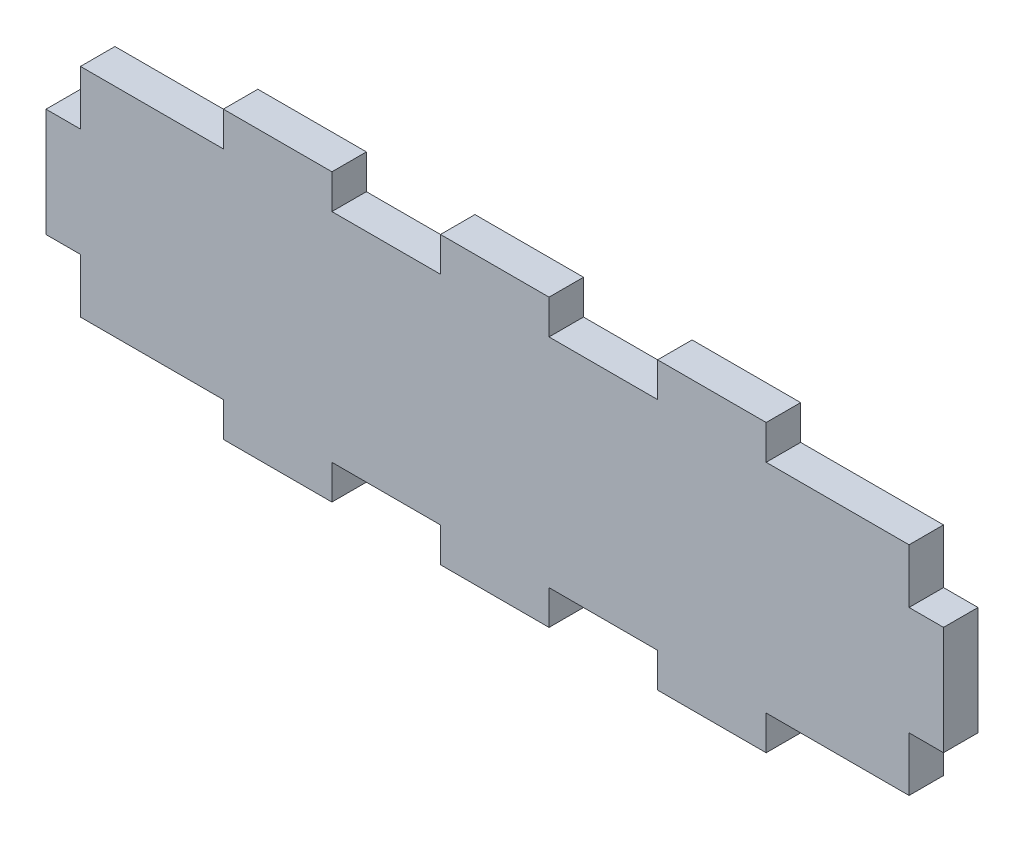
ISO-10303-21;
HEADER;
FILE_DESCRIPTION(('STEP AP214'),'2;1');
FILE_NAME('part.step','',(''),(''),'','','');
FILE_SCHEMA(('AUTOMOTIVE_DESIGN { 1 0 10303 214 1 1 1 1 }'));
ENDSEC;
DATA;
#1=APPLICATION_CONTEXT('core data for automotive mechanical design processes');
#2=APPLICATION_PROTOCOL_DEFINITION('international standard','automotive_design',2000,#1);
#3=PRODUCT_CONTEXT('',#1,'mechanical');
#4=PRODUCT('Part','Part','',(#3));
#5=PRODUCT_RELATED_PRODUCT_CATEGORY('part','',(#4));
#6=PRODUCT_DEFINITION_FORMATION('','',#4);
#7=PRODUCT_DEFINITION_CONTEXT('part definition',#1,'design');
#8=PRODUCT_DEFINITION('design','',#6,#7);
#9=PRODUCT_DEFINITION_SHAPE('','',#8);
#10=(LENGTH_UNIT() NAMED_UNIT(*) SI_UNIT(.MILLI.,.METRE.));
#11=(NAMED_UNIT(*) PLANE_ANGLE_UNIT() SI_UNIT($,.RADIAN.));
#12=(NAMED_UNIT(*) SI_UNIT($,.STERADIAN.) SOLID_ANGLE_UNIT());
#13=UNCERTAINTY_MEASURE_WITH_UNIT(LENGTH_MEASURE(1.E-05),#10,'distance_accuracy_value','');
#14=(GEOMETRIC_REPRESENTATION_CONTEXT(3) GLOBAL_UNCERTAINTY_ASSIGNED_CONTEXT((#13)) GLOBAL_UNIT_ASSIGNED_CONTEXT((#10,
#11,#12)) REPRESENTATION_CONTEXT('',''));
#15=CARTESIAN_POINT('',(0.,0.,0.));
#16=DIRECTION('',(0.,0.,1.));
#17=DIRECTION('',(1.,0.,0.));
#18=AXIS2_PLACEMENT_3D('',#15,#16,#17);
#19=CARTESIAN_POINT('',(-82.675,26.35,6.35));
#20=DIRECTION('',(0.,-1.,0.));
#21=DIRECTION('',(0.,0.,-1.));
#22=AXIS2_PLACEMENT_3D('',#19,#20,#21);
#23=PLANE('',#22);
#24=DIRECTION('',(0.,0.,1.));
#25=VECTOR('',#24,1.);
#26=CARTESIAN_POINT('',(-50.,26.35,0.));
#27=LINE('',#26,#25);
#28=CARTESIAN_POINT('',(-50.,26.35,0.));
#29=VERTEX_POINT('',#28);
#30=CARTESIAN_POINT('',(-50.,26.35,6.35));
#31=VERTEX_POINT('',#30);
#32=EDGE_CURVE('E356',#29,#31,#27,.T.);
#33=ORIENTED_EDGE('',*,*,#32,.T.);
#34=DIRECTION('',(-1.,0.,0.));
#35=VECTOR('',#34,1.);
#36=CARTESIAN_POINT('',(-82.675,26.35,6.35));
#37=LINE('',#36,#35);
#38=CARTESIAN_POINT('',(-30.,26.35,6.35));
#39=VERTEX_POINT('',#38);
#40=EDGE_CURVE('E51',#39,#31,#37,.T.);
#41=ORIENTED_EDGE('',*,*,#40,.F.);
#42=DIRECTION('',(0.,0.,1.));
#43=VECTOR('',#42,1.);
#44=CARTESIAN_POINT('',(-30.,26.35,0.));
#45=LINE('',#44,#43);
#46=CARTESIAN_POINT('',(-30.,26.35,0.));
#47=VERTEX_POINT('',#46);
#48=EDGE_CURVE('E394',#47,#39,#45,.T.);
#49=ORIENTED_EDGE('',*,*,#48,.F.);
#50=DIRECTION('',(-1.,0.,0.));
#51=VECTOR('',#50,1.);
#52=CARTESIAN_POINT('',(-82.675,26.35,0.));
#53=LINE('',#52,#51);
#54=EDGE_CURVE('E43',#47,#29,#53,.T.);
#55=ORIENTED_EDGE('',*,*,#54,.T.);
#56=EDGE_LOOP('',(#33,#41,#49,#55));
#57=FACE_BOUND('',#56,.T.);
#58=ADVANCED_FACE('F39',(#57),#23,.F.);
#59=DIRECTION('',(0.,0.,1.));
#60=VECTOR('',#59,1.);
#61=CARTESIAN_POINT('',(50.,26.35,0.));
#62=LINE('',#61,#60);
#63=CARTESIAN_POINT('',(50.,26.35,0.));
#64=VERTEX_POINT('',#63);
#65=CARTESIAN_POINT('',(50.,26.35,6.35));
#66=VERTEX_POINT('',#65);
#67=EDGE_CURVE('E312',#64,#66,#62,.T.);
#68=ORIENTED_EDGE('',*,*,#67,.F.);
#69=CARTESIAN_POINT('',(30.,26.35,0.));
#70=VERTEX_POINT('',#69);
#71=EDGE_CURVE('E619',#64,#70,#53,.T.);
#72=ORIENTED_EDGE('',*,*,#71,.T.);
#73=DIRECTION('',(0.,0.,1.));
#74=VECTOR('',#73,1.);
#75=CARTESIAN_POINT('',(30.,26.35,0.));
#76=LINE('',#75,#74);
#77=CARTESIAN_POINT('',(30.,26.35,6.35));
#78=VERTEX_POINT('',#77);
#79=EDGE_CURVE('E319',#70,#78,#76,.T.);
#80=ORIENTED_EDGE('',*,*,#79,.T.);
#81=EDGE_CURVE('E11',#66,#78,#37,.T.);
#82=ORIENTED_EDGE('',*,*,#81,.F.);
#83=EDGE_LOOP('',(#68,#72,#80,#82));
#84=FACE_BOUND('',#83,.T.);
#85=ADVANCED_FACE('F697',(#84),#23,.F.);
#86=DIRECTION('',(0.,0.,1.));
#87=VECTOR('',#86,1.);
#88=CARTESIAN_POINT('',(9.99999999999999,26.35,0.));
#89=LINE('',#88,#87);
#90=CARTESIAN_POINT('',(9.99999999999999,26.35,0.));
#91=VERTEX_POINT('',#90);
#92=CARTESIAN_POINT('',(9.99999999999999,26.35,6.35));
#93=VERTEX_POINT('',#92);
#94=EDGE_CURVE('E315',#91,#93,#89,.T.);
#95=ORIENTED_EDGE('',*,*,#94,.F.);
#96=CARTESIAN_POINT('',(-10.,26.35,0.));
#97=VERTEX_POINT('',#96);
#98=EDGE_CURVE('E299',#91,#97,#53,.T.);
#99=ORIENTED_EDGE('',*,*,#98,.T.);
#100=DIRECTION('',(0.,0.,1.));
#101=VECTOR('',#100,1.);
#102=CARTESIAN_POINT('',(-10.,26.35,0.));
#103=LINE('',#102,#101);
#104=CARTESIAN_POINT('',(-10.,26.35,6.35));
#105=VERTEX_POINT('',#104);
#106=EDGE_CURVE('E398',#97,#105,#103,.T.);
#107=ORIENTED_EDGE('',*,*,#106,.T.);
#108=EDGE_CURVE('E49',#93,#105,#37,.T.);
#109=ORIENTED_EDGE('',*,*,#108,.F.);
#110=EDGE_LOOP('',(#95,#99,#107,#109));
#111=FACE_BOUND('',#110,.T.);
#112=ADVANCED_FACE('F700',(#111),#23,.F.);
#113=CARTESIAN_POINT('',(0.,0.,6.35));
#114=DIRECTION('',(0.,0.,1.));
#115=DIRECTION('',(1.,0.,0.));
#116=AXIS2_PLACEMENT_3D('',#113,#114,#115);
#117=PLANE('',#116);
#118=ORIENTED_EDGE('',*,*,#40,.T.);
#119=DIRECTION('',(0.,-1.,0.));
#120=VECTOR('',#119,1.);
#121=CARTESIAN_POINT('',(-50.,26.35,6.35));
#122=LINE('',#121,#120);
#123=CARTESIAN_POINT('',(-50.,20.,6.35));
#124=VERTEX_POINT('',#123);
#125=EDGE_CURVE('E357',#31,#124,#122,.T.);
#126=ORIENTED_EDGE('',*,*,#125,.T.);
#127=DIRECTION('',(-1.,0.,0.));
#128=VECTOR('',#127,1.);
#129=CARTESIAN_POINT('',(-50.,20.,6.35));
#130=LINE('',#129,#128);
#131=CARTESIAN_POINT('',(-76.325,20.,6.35));
#132=VERTEX_POINT('',#131);
#133=EDGE_CURVE('E353',#124,#132,#130,.T.);
#134=ORIENTED_EDGE('',*,*,#133,.T.);
#135=DIRECTION('',(0.,1.,0.));
#136=VECTOR('',#135,1.);
#137=CARTESIAN_POINT('',(-76.325,26.35,6.35));
#138=LINE('',#137,#136);
#139=CARTESIAN_POINT('',(-76.325,10.,6.35));
#140=VERTEX_POINT('',#139);
#141=EDGE_CURVE('E599',#140,#132,#138,.T.);
#142=ORIENTED_EDGE('',*,*,#141,.F.);
#143=DIRECTION('',(1.,0.,0.));
#144=VECTOR('',#143,1.);
#145=CARTESIAN_POINT('',(-82.675,10.,6.35));
#146=LINE('',#145,#144);
#147=CARTESIAN_POINT('',(-82.675,10.,6.35));
#148=VERTEX_POINT('',#147);
#149=EDGE_CURVE('E547',#148,#140,#146,.T.);
#150=ORIENTED_EDGE('',*,*,#149,.F.);
#151=DIRECTION('',(0.,-1.,0.));
#152=VECTOR('',#151,1.);
#153=CARTESIAN_POINT('',(-82.675,26.35,6.35));
#154=LINE('',#153,#152);
#155=CARTESIAN_POINT('',(-82.675,-10.,6.35));
#156=VERTEX_POINT('',#155);
#157=EDGE_CURVE('E614',#148,#156,#154,.T.);
#158=ORIENTED_EDGE('',*,*,#157,.T.);
#159=DIRECTION('',(-1.,0.,0.));
#160=VECTOR('',#159,1.);
#161=CARTESIAN_POINT('',(-82.675,-10.,6.35));
#162=LINE('',#161,#160);
#163=CARTESIAN_POINT('',(-76.325,-10.,6.35));
#164=VERTEX_POINT('',#163);
#165=EDGE_CURVE('E575',#164,#156,#162,.T.);
#166=ORIENTED_EDGE('',*,*,#165,.F.);
#167=DIRECTION('',(0.,1.,0.));
#168=VECTOR('',#167,1.);
#169=CARTESIAN_POINT('',(-76.325,-10.,6.35));
#170=LINE('',#169,#168);
#171=CARTESIAN_POINT('',(-76.325,-20.,6.35));
#172=VERTEX_POINT('',#171);
#173=EDGE_CURVE('E580',#172,#164,#170,.T.);
#174=ORIENTED_EDGE('',*,*,#173,.F.);
#175=DIRECTION('',(-1.,0.,0.));
#176=VECTOR('',#175,1.);
#177=CARTESIAN_POINT('',(-50.,-20.,6.35));
#178=LINE('',#177,#176);
#179=CARTESIAN_POINT('',(-50.,-20.,6.35));
#180=VERTEX_POINT('',#179);
#181=EDGE_CURVE('E474',#180,#172,#178,.T.);
#182=ORIENTED_EDGE('',*,*,#181,.F.);
#183=DIRECTION('',(0.,1.,0.));
#184=VECTOR('',#183,1.);
#185=CARTESIAN_POINT('',(-50.,-26.35,6.35));
#186=LINE('',#185,#184);
#187=CARTESIAN_POINT('',(-50.,-26.35,6.35));
#188=VERTEX_POINT('',#187);
#189=EDGE_CURVE('E397',#188,#180,#186,.T.);
#190=ORIENTED_EDGE('',*,*,#189,.F.);
#191=DIRECTION('',(1.,0.,0.));
#192=VECTOR('',#191,1.);
#193=CARTESIAN_POINT('',(-82.675,-26.35,6.35));
#194=LINE('',#193,#192);
#195=CARTESIAN_POINT('',(-30.,-26.35,6.35));
#196=VERTEX_POINT('',#195);
#197=EDGE_CURVE('E624',#188,#196,#194,.T.);
#198=ORIENTED_EDGE('',*,*,#197,.T.);
#199=DIRECTION('',(0.,-1.,0.));
#200=VECTOR('',#199,1.);
#201=CARTESIAN_POINT('',(-30.,-26.35,6.35));
#202=LINE('',#201,#200);
#203=CARTESIAN_POINT('',(-30.,-20.,6.35));
#204=VERTEX_POINT('',#203);
#205=EDGE_CURVE('E434',#204,#196,#202,.T.);
#206=ORIENTED_EDGE('',*,*,#205,.F.);
#207=DIRECTION('',(-1.,0.,0.));
#208=VECTOR('',#207,1.);
#209=CARTESIAN_POINT('',(-30.,-20.,6.35));
#210=LINE('',#209,#208);
#211=CARTESIAN_POINT('',(-10.,-20.,6.35));
#212=VERTEX_POINT('',#211);
#213=EDGE_CURVE('E497',#212,#204,#210,.T.);
#214=ORIENTED_EDGE('',*,*,#213,.F.);
#215=DIRECTION('',(0.,1.,0.));
#216=VECTOR('',#215,1.);
#217=CARTESIAN_POINT('',(-10.,-26.35,6.35));
#218=LINE('',#217,#216);
#219=CARTESIAN_POINT('',(-10.,-26.35,6.35));
#220=VERTEX_POINT('',#219);
#221=EDGE_CURVE('E508',#220,#212,#218,.T.);
#222=ORIENTED_EDGE('',*,*,#221,.F.);
#223=CARTESIAN_POINT('',(9.99999999999999,-26.35,6.35));
#224=VERTEX_POINT('',#223);
#225=EDGE_CURVE('E623',#220,#224,#194,.T.);
#226=ORIENTED_EDGE('',*,*,#225,.T.);
#227=DIRECTION('',(0.,-1.,0.));
#228=VECTOR('',#227,1.);
#229=CARTESIAN_POINT('',(9.99999999999999,-26.35,6.35));
#230=LINE('',#229,#228);
#231=CARTESIAN_POINT('',(9.99999999999999,-20.,6.35));
#232=VERTEX_POINT('',#231);
#233=EDGE_CURVE('E420',#232,#224,#230,.T.);
#234=ORIENTED_EDGE('',*,*,#233,.F.);
#235=DIRECTION('',(-1.,0.,0.));
#236=VECTOR('',#235,1.);
#237=CARTESIAN_POINT('',(9.99999999999999,-20.,6.35));
#238=LINE('',#237,#236);
#239=CARTESIAN_POINT('',(30.,-20.,6.35));
#240=VERTEX_POINT('',#239);
#241=EDGE_CURVE('E411',#240,#232,#238,.T.);
#242=ORIENTED_EDGE('',*,*,#241,.F.);
#243=DIRECTION('',(0.,1.,0.));
#244=VECTOR('',#243,1.);
#245=CARTESIAN_POINT('',(30.,-26.35,6.35));
#246=LINE('',#245,#244);
#247=CARTESIAN_POINT('',(30.,-26.35,6.35));
#248=VERTEX_POINT('',#247);
#249=EDGE_CURVE('E423',#248,#240,#246,.T.);
#250=ORIENTED_EDGE('',*,*,#249,.F.);
#251=CARTESIAN_POINT('',(50.,-26.35,6.35));
#252=VERTEX_POINT('',#251);
#253=EDGE_CURVE('E618',#248,#252,#194,.T.);
#254=ORIENTED_EDGE('',*,*,#253,.T.);
#255=DIRECTION('',(0.,-1.,0.));
#256=VECTOR('',#255,1.);
#257=CARTESIAN_POINT('',(50.,-26.35,6.35));
#258=LINE('',#257,#256);
#259=CARTESIAN_POINT('',(50.,-20.,6.35));
#260=VERTEX_POINT('',#259);
#261=EDGE_CURVE('E454',#260,#252,#258,.T.);
#262=ORIENTED_EDGE('',*,*,#261,.F.);
#263=DIRECTION('',(-1.,0.,0.));
#264=VECTOR('',#263,1.);
#265=CARTESIAN_POINT('',(50.,-20.,6.35));
#266=LINE('',#265,#264);
#267=CARTESIAN_POINT('',(76.325,-20.,6.35));
#268=VERTEX_POINT('',#267);
#269=EDGE_CURVE('E449',#268,#260,#266,.T.);
#270=ORIENTED_EDGE('',*,*,#269,.F.);
#271=DIRECTION('',(0.,1.,0.));
#272=VECTOR('',#271,1.);
#273=CARTESIAN_POINT('',(76.325,-10.,6.35));
#274=LINE('',#273,#272);
#275=CARTESIAN_POINT('',(76.325,-10.,6.35));
#276=VERTEX_POINT('',#275);
#277=EDGE_CURVE('E532',#268,#276,#274,.T.);
#278=ORIENTED_EDGE('',*,*,#277,.T.);
#279=DIRECTION('',(1.,0.,0.));
#280=VECTOR('',#279,1.);
#281=CARTESIAN_POINT('',(82.675,-10.,6.35));
#282=LINE('',#281,#280);
#283=CARTESIAN_POINT('',(82.675,-10.,6.35));
#284=VERTEX_POINT('',#283);
#285=EDGE_CURVE('E536',#276,#284,#282,.T.);
#286=ORIENTED_EDGE('',*,*,#285,.T.);
#287=DIRECTION('',(0.,1.,0.));
#288=VECTOR('',#287,1.);
#289=CARTESIAN_POINT('',(82.675,26.35,6.35));
#290=LINE('',#289,#288);
#291=CARTESIAN_POINT('',(82.675,10.,6.35));
#292=VERTEX_POINT('',#291);
#293=EDGE_CURVE('E625',#284,#292,#290,.T.);
#294=ORIENTED_EDGE('',*,*,#293,.T.);
#295=DIRECTION('',(-1.,0.,0.));
#296=VECTOR('',#295,1.);
#297=CARTESIAN_POINT('',(82.675,10.,6.35));
#298=LINE('',#297,#296);
#299=CARTESIAN_POINT('',(76.325,10.,6.35));
#300=VERTEX_POINT('',#299);
#301=EDGE_CURVE('E555',#292,#300,#298,.T.);
#302=ORIENTED_EDGE('',*,*,#301,.T.);
#303=DIRECTION('',(0.,1.,0.));
#304=VECTOR('',#303,1.);
#305=CARTESIAN_POINT('',(76.325,26.35,6.35));
#306=LINE('',#305,#304);
#307=CARTESIAN_POINT('',(76.325,20.,6.35));
#308=VERTEX_POINT('',#307);
#309=EDGE_CURVE('E518',#300,#308,#306,.T.);
#310=ORIENTED_EDGE('',*,*,#309,.T.);
#311=DIRECTION('',(-1.,0.,0.));
#312=VECTOR('',#311,1.);
#313=CARTESIAN_POINT('',(50.,20.,6.35));
#314=LINE('',#313,#312);
#315=CARTESIAN_POINT('',(50.,20.,6.35));
#316=VERTEX_POINT('',#315);
#317=EDGE_CURVE('E329',#308,#316,#314,.T.);
#318=ORIENTED_EDGE('',*,*,#317,.T.);
#319=DIRECTION('',(0.,1.,0.));
#320=VECTOR('',#319,1.);
#321=CARTESIAN_POINT('',(50.,26.35,6.35));
#322=LINE('',#321,#320);
#323=EDGE_CURVE('E333',#316,#66,#322,.T.);
#324=ORIENTED_EDGE('',*,*,#323,.T.);
#325=ORIENTED_EDGE('',*,*,#81,.T.);
#326=DIRECTION('',(0.,-1.,0.));
#327=VECTOR('',#326,1.);
#328=CARTESIAN_POINT('',(30.,26.35,6.35));
#329=LINE('',#328,#327);
#330=CARTESIAN_POINT('',(30.,20.,6.35));
#331=VERTEX_POINT('',#330);
#332=EDGE_CURVE('E301',#78,#331,#329,.T.);
#333=ORIENTED_EDGE('',*,*,#332,.T.);
#334=DIRECTION('',(-1.,0.,0.));
#335=VECTOR('',#334,1.);
#336=CARTESIAN_POINT('',(9.99999999999999,20.,6.35));
#337=LINE('',#336,#335);
#338=CARTESIAN_POINT('',(9.99999999999999,20.,6.35));
#339=VERTEX_POINT('',#338);
#340=EDGE_CURVE('E305',#331,#339,#337,.T.);
#341=ORIENTED_EDGE('',*,*,#340,.T.);
#342=DIRECTION('',(0.,1.,0.));
#343=VECTOR('',#342,1.);
#344=CARTESIAN_POINT('',(9.99999999999999,26.35,6.35));
#345=LINE('',#344,#343);
#346=EDGE_CURVE('E290',#339,#93,#345,.T.);
#347=ORIENTED_EDGE('',*,*,#346,.T.);
#348=ORIENTED_EDGE('',*,*,#108,.T.);
#349=DIRECTION('',(0.,-1.,0.));
#350=VECTOR('',#349,1.);
#351=CARTESIAN_POINT('',(-10.,26.35,6.35));
#352=LINE('',#351,#350);
#353=CARTESIAN_POINT('',(-10.,20.,6.35));
#354=VERTEX_POINT('',#353);
#355=EDGE_CURVE('E377',#105,#354,#352,.T.);
#356=ORIENTED_EDGE('',*,*,#355,.T.);
#357=DIRECTION('',(-1.,0.,0.));
#358=VECTOR('',#357,1.);
#359=CARTESIAN_POINT('',(-30.,20.,6.35));
#360=LINE('',#359,#358);
#361=CARTESIAN_POINT('',(-30.,20.,6.35));
#362=VERTEX_POINT('',#361);
#363=EDGE_CURVE('E387',#354,#362,#360,.T.);
#364=ORIENTED_EDGE('',*,*,#363,.T.);
#365=DIRECTION('',(0.,1.,0.));
#366=VECTOR('',#365,1.);
#367=CARTESIAN_POINT('',(-30.,26.35,6.35));
#368=LINE('',#367,#366);
#369=EDGE_CURVE('E318',#362,#39,#368,.T.);
#370=ORIENTED_EDGE('',*,*,#369,.T.);
#371=EDGE_LOOP('',(#118,#126,#134,#142,#150,#158,#166,#174,#182,#190,#198,#206,#214,#222,#226,
#234,#242,#250,#254,#262,#270,#278,#286,#294,#302,#310,#318,#324,#325,#333,#341,#347,#348,#356,
#364,#370));
#372=FACE_BOUND('',#371,.T.);
#373=ADVANCED_FACE('F666',(#372),#117,.T.);
#374=CARTESIAN_POINT('',(0.,0.,0.));
#375=DIRECTION('',(0.,0.,1.));
#376=DIRECTION('',(1.,0.,0.));
#377=AXIS2_PLACEMENT_3D('',#374,#375,#376);
#378=PLANE('',#377);
#379=DIRECTION('',(0.,-1.,0.));
#380=VECTOR('',#379,1.);
#381=CARTESIAN_POINT('',(-50.,26.35,0.));
#382=LINE('',#381,#380);
#383=CARTESIAN_POINT('',(-50.,20.,0.));
#384=VERTEX_POINT('',#383);
#385=EDGE_CURVE('E349',#29,#384,#382,.T.);
#386=ORIENTED_EDGE('',*,*,#385,.F.);
#387=ORIENTED_EDGE('',*,*,#54,.F.);
#388=DIRECTION('',(0.,1.,0.));
#389=VECTOR('',#388,1.);
#390=CARTESIAN_POINT('',(-30.,26.35,0.));
#391=LINE('',#390,#389);
#392=CARTESIAN_POINT('',(-30.,20.,0.));
#393=VERTEX_POINT('',#392);
#394=EDGE_CURVE('E373',#393,#47,#391,.T.);
#395=ORIENTED_EDGE('',*,*,#394,.F.);
#396=DIRECTION('',(-1.,0.,0.));
#397=VECTOR('',#396,1.);
#398=CARTESIAN_POINT('',(-30.,20.,0.));
#399=LINE('',#398,#397);
#400=CARTESIAN_POINT('',(-10.,20.,0.));
#401=VERTEX_POINT('',#400);
#402=EDGE_CURVE('E376',#401,#393,#399,.T.);
#403=ORIENTED_EDGE('',*,*,#402,.F.);
#404=DIRECTION('',(0.,-1.,0.));
#405=VECTOR('',#404,1.);
#406=CARTESIAN_POINT('',(-10.,26.35,0.));
#407=LINE('',#406,#405);
#408=EDGE_CURVE('E380',#97,#401,#407,.T.);
#409=ORIENTED_EDGE('',*,*,#408,.F.);
#410=ORIENTED_EDGE('',*,*,#98,.F.);
#411=DIRECTION('',(0.,1.,0.));
#412=VECTOR('',#411,1.);
#413=CARTESIAN_POINT('',(9.99999999999999,26.35,0.));
#414=LINE('',#413,#412);
#415=CARTESIAN_POINT('',(9.99999999999999,20.,0.));
#416=VERTEX_POINT('',#415);
#417=EDGE_CURVE('E284',#416,#91,#414,.T.);
#418=ORIENTED_EDGE('',*,*,#417,.F.);
#419=DIRECTION('',(-1.,0.,0.));
#420=VECTOR('',#419,1.);
#421=CARTESIAN_POINT('',(9.99999999999999,20.,0.));
#422=LINE('',#421,#420);
#423=CARTESIAN_POINT('',(30.,20.,0.));
#424=VERTEX_POINT('',#423);
#425=EDGE_CURVE('E274',#424,#416,#422,.T.);
#426=ORIENTED_EDGE('',*,*,#425,.F.);
#427=DIRECTION('',(0.,-1.,0.));
#428=VECTOR('',#427,1.);
#429=CARTESIAN_POINT('',(30.,26.35,0.));
#430=LINE('',#429,#428);
#431=EDGE_CURVE('E283',#70,#424,#430,.T.);
#432=ORIENTED_EDGE('',*,*,#431,.F.);
#433=ORIENTED_EDGE('',*,*,#71,.F.);
#434=DIRECTION('',(0.,1.,0.));
#435=VECTOR('',#434,1.);
#436=CARTESIAN_POINT('',(50.,26.35,0.));
#437=LINE('',#436,#435);
#438=CARTESIAN_POINT('',(50.,20.,0.));
#439=VERTEX_POINT('',#438);
#440=EDGE_CURVE('E325',#439,#64,#437,.T.);
#441=ORIENTED_EDGE('',*,*,#440,.F.);
#442=DIRECTION('',(-1.,0.,0.));
#443=VECTOR('',#442,1.);
#444=CARTESIAN_POINT('',(50.,20.,0.));
#445=LINE('',#444,#443);
#446=CARTESIAN_POINT('',(76.325,20.,0.));
#447=VERTEX_POINT('',#446);
#448=EDGE_CURVE('E328',#447,#439,#445,.T.);
#449=ORIENTED_EDGE('',*,*,#448,.F.);
#450=DIRECTION('',(0.,1.,0.));
#451=VECTOR('',#450,1.);
#452=CARTESIAN_POINT('',(76.325,26.35,0.));
#453=LINE('',#452,#451);
#454=CARTESIAN_POINT('',(76.325,10.,0.));
#455=VERTEX_POINT('',#454);
#456=EDGE_CURVE('E550',#455,#447,#453,.T.);
#457=ORIENTED_EDGE('',*,*,#456,.F.);
#458=DIRECTION('',(-1.,0.,0.));
#459=VECTOR('',#458,1.);
#460=CARTESIAN_POINT('',(82.675,10.,0.));
#461=LINE('',#460,#459);
#462=CARTESIAN_POINT('',(82.675,10.,0.));
#463=VERTEX_POINT('',#462);
#464=EDGE_CURVE('E554',#463,#455,#461,.T.);
#465=ORIENTED_EDGE('',*,*,#464,.F.);
#466=DIRECTION('',(0.,1.,0.));
#467=VECTOR('',#466,1.);
#468=CARTESIAN_POINT('',(82.675,26.35,0.));
#469=LINE('',#468,#467);
#470=CARTESIAN_POINT('',(82.675,-10.,0.));
#471=VERTEX_POINT('',#470);
#472=EDGE_CURVE('E639',#471,#463,#469,.T.);
#473=ORIENTED_EDGE('',*,*,#472,.F.);
#474=DIRECTION('',(1.,0.,0.));
#475=VECTOR('',#474,1.);
#476=CARTESIAN_POINT('',(82.675,-10.,0.));
#477=LINE('',#476,#475);
#478=CARTESIAN_POINT('',(76.325,-10.,0.));
#479=VERTEX_POINT('',#478);
#480=EDGE_CURVE('E528',#479,#471,#477,.T.);
#481=ORIENTED_EDGE('',*,*,#480,.F.);
#482=DIRECTION('',(0.,1.,0.));
#483=VECTOR('',#482,1.);
#484=CARTESIAN_POINT('',(76.325,-10.,0.));
#485=LINE('',#484,#483);
#486=CARTESIAN_POINT('',(76.325,-20.,0.));
#487=VERTEX_POINT('',#486);
#488=EDGE_CURVE('E531',#487,#479,#485,.T.);
#489=ORIENTED_EDGE('',*,*,#488,.F.);
#490=DIRECTION('',(-1.,0.,0.));
#491=VECTOR('',#490,1.);
#492=CARTESIAN_POINT('',(50.,-20.,0.));
#493=LINE('',#492,#491);
#494=CARTESIAN_POINT('',(50.,-20.,0.));
#495=VERTEX_POINT('',#494);
#496=EDGE_CURVE('E448',#487,#495,#493,.T.);
#497=ORIENTED_EDGE('',*,*,#496,.T.);
#498=DIRECTION('',(0.,-1.,0.));
#499=VECTOR('',#498,1.);
#500=CARTESIAN_POINT('',(50.,-26.35,0.));
#501=LINE('',#500,#499);
#502=CARTESIAN_POINT('',(50.,-26.35,0.));
#503=VERTEX_POINT('',#502);
#504=EDGE_CURVE('E444',#495,#503,#501,.T.);
#505=ORIENTED_EDGE('',*,*,#504,.T.);
#506=DIRECTION('',(1.,0.,0.));
#507=VECTOR('',#506,1.);
#508=CARTESIAN_POINT('',(-82.675,-26.35,0.));
#509=LINE('',#508,#507);
#510=CARTESIAN_POINT('',(30.,-26.35,0.));
#511=VERTEX_POINT('',#510);
#512=EDGE_CURVE('E634',#511,#503,#509,.T.);
#513=ORIENTED_EDGE('',*,*,#512,.F.);
#514=DIRECTION('',(0.,1.,0.));
#515=VECTOR('',#514,1.);
#516=CARTESIAN_POINT('',(30.,-26.35,0.));
#517=LINE('',#516,#515);
#518=CARTESIAN_POINT('',(30.,-20.,0.));
#519=VERTEX_POINT('',#518);
#520=EDGE_CURVE('E410',#511,#519,#517,.T.);
#521=ORIENTED_EDGE('',*,*,#520,.T.);
#522=DIRECTION('',(-1.,0.,0.));
#523=VECTOR('',#522,1.);
#524=CARTESIAN_POINT('',(9.99999999999999,-20.,0.));
#525=LINE('',#524,#523);
#526=CARTESIAN_POINT('',(9.99999999999999,-20.,0.));
#527=VERTEX_POINT('',#526);
#528=EDGE_CURVE('E415',#519,#527,#525,.T.);
#529=ORIENTED_EDGE('',*,*,#528,.T.);
#530=DIRECTION('',(0.,-1.,0.));
#531=VECTOR('',#530,1.);
#532=CARTESIAN_POINT('',(9.99999999999999,-26.35,0.));
#533=LINE('',#532,#531);
#534=CARTESIAN_POINT('',(9.99999999999999,-26.35,0.));
#535=VERTEX_POINT('',#534);
#536=EDGE_CURVE('E406',#527,#535,#533,.T.);
#537=ORIENTED_EDGE('',*,*,#536,.T.);
#538=CARTESIAN_POINT('',(-10.,-26.35,0.));
#539=VERTEX_POINT('',#538);
#540=EDGE_CURVE('E637',#539,#535,#509,.T.);
#541=ORIENTED_EDGE('',*,*,#540,.F.);
#542=DIRECTION('',(0.,1.,0.));
#543=VECTOR('',#542,1.);
#544=CARTESIAN_POINT('',(-10.,-26.35,0.));
#545=LINE('',#544,#543);
#546=CARTESIAN_POINT('',(-10.,-20.,0.));
#547=VERTEX_POINT('',#546);
#548=EDGE_CURVE('E496',#539,#547,#545,.T.);
#549=ORIENTED_EDGE('',*,*,#548,.T.);
#550=DIRECTION('',(-1.,0.,0.));
#551=VECTOR('',#550,1.);
#552=CARTESIAN_POINT('',(-30.,-20.,0.));
#553=LINE('',#552,#551);
#554=CARTESIAN_POINT('',(-30.,-20.,0.));
#555=VERTEX_POINT('',#554);
#556=EDGE_CURVE('E501',#547,#555,#553,.T.);
#557=ORIENTED_EDGE('',*,*,#556,.T.);
#558=DIRECTION('',(0.,-1.,0.));
#559=VECTOR('',#558,1.);
#560=CARTESIAN_POINT('',(-30.,-26.35,0.));
#561=LINE('',#560,#559);
#562=CARTESIAN_POINT('',(-30.,-26.35,0.));
#563=VERTEX_POINT('',#562);
#564=EDGE_CURVE('E492',#555,#563,#561,.T.);
#565=ORIENTED_EDGE('',*,*,#564,.T.);
#566=CARTESIAN_POINT('',(-50.,-26.35,0.));
#567=VERTEX_POINT('',#566);
#568=EDGE_CURVE('E638',#567,#563,#509,.T.);
#569=ORIENTED_EDGE('',*,*,#568,.F.);
#570=DIRECTION('',(0.,1.,0.));
#571=VECTOR('',#570,1.);
#572=CARTESIAN_POINT('',(-50.,-26.35,0.));
#573=LINE('',#572,#571);
#574=CARTESIAN_POINT('',(-50.,-20.,0.));
#575=VERTEX_POINT('',#574);
#576=EDGE_CURVE('E469',#567,#575,#573,.T.);
#577=ORIENTED_EDGE('',*,*,#576,.T.);
#578=DIRECTION('',(-1.,0.,0.));
#579=VECTOR('',#578,1.);
#580=CARTESIAN_POINT('',(-50.,-20.,0.));
#581=LINE('',#580,#579);
#582=CARTESIAN_POINT('',(-76.325,-20.,0.));
#583=VERTEX_POINT('',#582);
#584=EDGE_CURVE('E473',#575,#583,#581,.T.);
#585=ORIENTED_EDGE('',*,*,#584,.T.);
#586=DIRECTION('',(0.,1.,0.));
#587=VECTOR('',#586,1.);
#588=CARTESIAN_POINT('',(-76.325,-10.,0.));
#589=LINE('',#588,#587);
#590=CARTESIAN_POINT('',(-76.325,-10.,0.));
#591=VERTEX_POINT('',#590);
#592=EDGE_CURVE('E571',#583,#591,#589,.T.);
#593=ORIENTED_EDGE('',*,*,#592,.T.);
#594=DIRECTION('',(-1.,0.,0.));
#595=VECTOR('',#594,1.);
#596=CARTESIAN_POINT('',(-82.675,-10.,0.));
#597=LINE('',#596,#595);
#598=CARTESIAN_POINT('',(-82.675,-10.,0.));
#599=VERTEX_POINT('',#598);
#600=EDGE_CURVE('E574',#591,#599,#597,.T.);
#601=ORIENTED_EDGE('',*,*,#600,.T.);
#602=DIRECTION('',(0.,-1.,0.));
#603=VECTOR('',#602,1.);
#604=CARTESIAN_POINT('',(-82.675,26.35,0.));
#605=LINE('',#604,#603);
#606=CARTESIAN_POINT('',(-82.675,10.,0.));
#607=VERTEX_POINT('',#606);
#608=EDGE_CURVE('E590',#607,#599,#605,.T.);
#609=ORIENTED_EDGE('',*,*,#608,.F.);
#610=DIRECTION('',(1.,0.,0.));
#611=VECTOR('',#610,1.);
#612=CARTESIAN_POINT('',(-82.675,10.,0.));
#613=LINE('',#612,#611);
#614=CARTESIAN_POINT('',(-76.325,10.,0.));
#615=VERTEX_POINT('',#614);
#616=EDGE_CURVE('E594',#607,#615,#613,.T.);
#617=ORIENTED_EDGE('',*,*,#616,.T.);
#618=DIRECTION('',(0.,1.,0.));
#619=VECTOR('',#618,1.);
#620=CARTESIAN_POINT('',(-76.325,26.35,0.));
#621=LINE('',#620,#619);
#622=CARTESIAN_POINT('',(-76.325,20.,0.));
#623=VERTEX_POINT('',#622);
#624=EDGE_CURVE('E598',#615,#623,#621,.T.);
#625=ORIENTED_EDGE('',*,*,#624,.T.);
#626=DIRECTION('',(-1.,0.,0.));
#627=VECTOR('',#626,1.);
#628=CARTESIAN_POINT('',(-50.,20.,0.));
#629=LINE('',#628,#627);
#630=EDGE_CURVE('E352',#384,#623,#629,.T.);
#631=ORIENTED_EDGE('',*,*,#630,.F.);
#632=EDGE_LOOP('',(#386,#387,#395,#403,#409,#410,#418,#426,#432,#433,#441,#449,#457,#465,#473,
#481,#489,#497,#505,#513,#521,#529,#537,#541,#549,#557,#565,#569,#577,#585,#593,#601,#609,#617,
#625,#631));
#633=FACE_BOUND('',#632,.T.);
#634=ADVANCED_FACE('F296',(#633),#378,.F.);
#635=CARTESIAN_POINT('',(-76.325,26.35,0.));
#636=DIRECTION('',(1.,0.,0.));
#637=DIRECTION('',(0.,0.,-1.));
#638=AXIS2_PLACEMENT_3D('',#635,#636,#637);
#639=PLANE('',#638);
#640=DIRECTION('',(0.,0.,1.));
#641=VECTOR('',#640,1.);
#642=CARTESIAN_POINT('',(-76.325,20.,0.));
#643=LINE('',#642,#641);
#644=EDGE_CURVE('E367',#623,#132,#643,.T.);
#645=ORIENTED_EDGE('',*,*,#644,.F.);
#646=ORIENTED_EDGE('',*,*,#624,.F.);
#647=DIRECTION('',(0.,0.,1.));
#648=VECTOR('',#647,1.);
#649=CARTESIAN_POINT('',(-76.325,10.,0.));
#650=LINE('',#649,#648);
#651=EDGE_CURVE('E583',#615,#140,#650,.T.);
#652=ORIENTED_EDGE('',*,*,#651,.T.);
#653=ORIENTED_EDGE('',*,*,#141,.T.);
#654=EDGE_LOOP('',(#645,#646,#652,#653));
#655=FACE_BOUND('',#654,.T.);
#656=ADVANCED_FACE('F811',(#655),#639,.F.);
#657=CARTESIAN_POINT('',(76.325,26.35,0.));
#658=DIRECTION('',(1.,0.,0.));
#659=DIRECTION('',(0.,0.,-1.));
#660=AXIS2_PLACEMENT_3D('',#657,#658,#659);
#661=PLANE('',#660);
#662=ORIENTED_EDGE('',*,*,#456,.T.);
#663=DIRECTION('',(0.,0.,1.));
#664=VECTOR('',#663,1.);
#665=CARTESIAN_POINT('',(76.325,20.,0.));
#666=LINE('',#665,#664);
#667=EDGE_CURVE('E343',#447,#308,#666,.T.);
#668=ORIENTED_EDGE('',*,*,#667,.T.);
#669=ORIENTED_EDGE('',*,*,#309,.F.);
#670=DIRECTION('',(0.,0.,1.));
#671=VECTOR('',#670,1.);
#672=CARTESIAN_POINT('',(76.325,10.,0.));
#673=LINE('',#672,#671);
#674=EDGE_CURVE('E559',#455,#300,#673,.T.);
#675=ORIENTED_EDGE('',*,*,#674,.F.);
#676=EDGE_LOOP('',(#662,#668,#669,#675));
#677=FACE_BOUND('',#676,.T.);
#678=ADVANCED_FACE('F734',(#677),#661,.T.);
#679=CARTESIAN_POINT('',(-82.675,-26.35,6.35));
#680=DIRECTION('',(0.,1.,0.));
#681=DIRECTION('',(0.,0.,1.));
#682=AXIS2_PLACEMENT_3D('',#679,#680,#681);
#683=PLANE('',#682);
#684=ORIENTED_EDGE('',*,*,#540,.T.);
#685=DIRECTION('',(0.,0.,1.));
#686=VECTOR('',#685,1.);
#687=CARTESIAN_POINT('',(9.99999999999999,-26.35,0.));
#688=LINE('',#687,#686);
#689=EDGE_CURVE('E419',#535,#224,#688,.T.);
#690=ORIENTED_EDGE('',*,*,#689,.T.);
#691=ORIENTED_EDGE('',*,*,#225,.F.);
#692=DIRECTION('',(0.,0.,1.));
#693=VECTOR('',#692,1.);
#694=CARTESIAN_POINT('',(-10.,-26.35,0.));
#695=LINE('',#694,#693);
#696=EDGE_CURVE('E522',#539,#220,#695,.T.);
#697=ORIENTED_EDGE('',*,*,#696,.F.);
#698=EDGE_LOOP('',(#684,#690,#691,#697));
#699=FACE_BOUND('',#698,.T.);
#700=ADVANCED_FACE('F657',(#699),#683,.F.);
#701=ORIENTED_EDGE('',*,*,#197,.F.);
#702=DIRECTION('',(0.,0.,1.));
#703=VECTOR('',#702,1.);
#704=CARTESIAN_POINT('',(-50.,-26.35,0.));
#705=LINE('',#704,#703);
#706=EDGE_CURVE('E457',#567,#188,#705,.T.);
#707=ORIENTED_EDGE('',*,*,#706,.F.);
#708=ORIENTED_EDGE('',*,*,#568,.T.);
#709=DIRECTION('',(0.,0.,1.));
#710=VECTOR('',#709,1.);
#711=CARTESIAN_POINT('',(-30.,-26.35,0.));
#712=LINE('',#711,#710);
#713=EDGE_CURVE('E505',#563,#196,#712,.T.);
#714=ORIENTED_EDGE('',*,*,#713,.T.);
#715=EDGE_LOOP('',(#701,#707,#708,#714));
#716=FACE_BOUND('',#715,.T.);
#717=ADVANCED_FACE('F677',(#716),#683,.F.);
#718=ORIENTED_EDGE('',*,*,#512,.T.);
#719=DIRECTION('',(0.,0.,1.));
#720=VECTOR('',#719,1.);
#721=CARTESIAN_POINT('',(50.,-26.35,0.));
#722=LINE('',#721,#720);
#723=EDGE_CURVE('E453',#503,#252,#722,.T.);
#724=ORIENTED_EDGE('',*,*,#723,.T.);
#725=ORIENTED_EDGE('',*,*,#253,.F.);
#726=DIRECTION('',(0.,0.,1.));
#727=VECTOR('',#726,1.);
#728=CARTESIAN_POINT('',(30.,-26.35,0.));
#729=LINE('',#728,#727);
#730=EDGE_CURVE('E438',#511,#248,#729,.T.);
#731=ORIENTED_EDGE('',*,*,#730,.F.);
#732=EDGE_LOOP('',(#718,#724,#725,#731));
#733=FACE_BOUND('',#732,.T.);
#734=ADVANCED_FACE('F759',(#733),#683,.F.);
#735=CARTESIAN_POINT('',(82.675,26.35,6.35));
#736=DIRECTION('',(-1.,0.,0.));
#737=DIRECTION('',(0.,0.,1.));
#738=AXIS2_PLACEMENT_3D('',#735,#736,#737);
#739=PLANE('',#738);
#740=DIRECTION('',(0.,0.,1.));
#741=VECTOR('',#740,1.);
#742=CARTESIAN_POINT('',(82.675,-10.,0.));
#743=LINE('',#742,#741);
#744=EDGE_CURVE('E535',#471,#284,#743,.T.);
#745=ORIENTED_EDGE('',*,*,#744,.F.);
#746=ORIENTED_EDGE('',*,*,#472,.T.);
#747=DIRECTION('',(0.,0.,1.));
#748=VECTOR('',#747,1.);
#749=CARTESIAN_POINT('',(82.675,10.,0.));
#750=LINE('',#749,#748);
#751=EDGE_CURVE('E540',#463,#292,#750,.T.);
#752=ORIENTED_EDGE('',*,*,#751,.T.);
#753=ORIENTED_EDGE('',*,*,#293,.F.);
#754=EDGE_LOOP('',(#745,#746,#752,#753));
#755=FACE_BOUND('',#754,.T.);
#756=ADVANCED_FACE('F739',(#755),#739,.F.);
#757=CARTESIAN_POINT('',(-82.675,26.35,6.35));
#758=DIRECTION('',(1.,0.,0.));
#759=DIRECTION('',(0.,0.,-1.));
#760=AXIS2_PLACEMENT_3D('',#757,#758,#759);
#761=PLANE('',#760);
#762=ORIENTED_EDGE('',*,*,#608,.T.);
#763=DIRECTION('',(0.,0.,1.));
#764=VECTOR('',#763,1.);
#765=CARTESIAN_POINT('',(-82.675,-10.,0.));
#766=LINE('',#765,#764);
#767=EDGE_CURVE('E586',#599,#156,#766,.T.);
#768=ORIENTED_EDGE('',*,*,#767,.T.);
#769=ORIENTED_EDGE('',*,*,#157,.F.);
#770=DIRECTION('',(0.,0.,1.));
#771=VECTOR('',#770,1.);
#772=CARTESIAN_POINT('',(-82.675,10.,0.));
#773=LINE('',#772,#771);
#774=EDGE_CURVE('E603',#607,#148,#773,.T.);
#775=ORIENTED_EDGE('',*,*,#774,.F.);
#776=EDGE_LOOP('',(#762,#768,#769,#775));
#777=FACE_BOUND('',#776,.T.);
#778=ADVANCED_FACE('F41',(#777),#761,.F.);
#779=CARTESIAN_POINT('',(-82.675,10.,0.));
#780=DIRECTION('',(0.,-1.,0.));
#781=DIRECTION('',(0.,0.,-1.));
#782=AXIS2_PLACEMENT_3D('',#779,#780,#781);
#783=PLANE('',#782);
#784=ORIENTED_EDGE('',*,*,#149,.T.);
#785=ORIENTED_EDGE('',*,*,#651,.F.);
#786=ORIENTED_EDGE('',*,*,#616,.F.);
#787=ORIENTED_EDGE('',*,*,#774,.T.);
#788=EDGE_LOOP('',(#784,#785,#786,#787));
#789=FACE_BOUND('',#788,.T.);
#790=ADVANCED_FACE('F807',(#789),#783,.F.);
#791=CARTESIAN_POINT('',(-82.675,-10.,0.));
#792=DIRECTION('',(0.,1.,0.));
#793=DIRECTION('',(0.,0.,1.));
#794=AXIS2_PLACEMENT_3D('',#791,#792,#793);
#795=PLANE('',#794);
#796=ORIENTED_EDGE('',*,*,#165,.T.);
#797=ORIENTED_EDGE('',*,*,#767,.F.);
#798=ORIENTED_EDGE('',*,*,#600,.F.);
#799=DIRECTION('',(0.,0.,1.));
#800=VECTOR('',#799,1.);
#801=CARTESIAN_POINT('',(-76.325,-10.,0.));
#802=LINE('',#801,#800);
#803=EDGE_CURVE('E579',#591,#164,#802,.T.);
#804=ORIENTED_EDGE('',*,*,#803,.T.);
#805=EDGE_LOOP('',(#796,#797,#798,#804));
#806=FACE_BOUND('',#805,.T.);
#807=ADVANCED_FACE('F799',(#806),#795,.F.);
#808=CARTESIAN_POINT('',(-76.325,-10.,0.));
#809=DIRECTION('',(1.,0.,0.));
#810=DIRECTION('',(0.,0.,-1.));
#811=AXIS2_PLACEMENT_3D('',#808,#809,#810);
#812=PLANE('',#811);
#813=ORIENTED_EDGE('',*,*,#592,.F.);
#814=DIRECTION('',(0.,0.,1.));
#815=VECTOR('',#814,1.);
#816=CARTESIAN_POINT('',(-76.325,-20.,0.));
#817=LINE('',#816,#815);
#818=EDGE_CURVE('E486',#583,#172,#817,.T.);
#819=ORIENTED_EDGE('',*,*,#818,.T.);
#820=ORIENTED_EDGE('',*,*,#173,.T.);
#821=ORIENTED_EDGE('',*,*,#803,.F.);
#822=EDGE_LOOP('',(#813,#819,#820,#821));
#823=FACE_BOUND('',#822,.T.);
#824=ADVANCED_FACE('F794',(#823),#812,.F.);
#825=CARTESIAN_POINT('',(82.675,10.,0.));
#826=DIRECTION('',(0.,1.,0.));
#827=DIRECTION('',(0.,0.,1.));
#828=AXIS2_PLACEMENT_3D('',#825,#826,#827);
#829=PLANE('',#828);
#830=ORIENTED_EDGE('',*,*,#301,.F.);
#831=ORIENTED_EDGE('',*,*,#751,.F.);
#832=ORIENTED_EDGE('',*,*,#464,.T.);
#833=ORIENTED_EDGE('',*,*,#674,.T.);
#834=EDGE_LOOP('',(#830,#831,#832,#833));
#835=FACE_BOUND('',#834,.T.);
#836=ADVANCED_FACE('F737',(#835),#829,.T.);
#837=CARTESIAN_POINT('',(76.325,-10.,0.));
#838=DIRECTION('',(1.,0.,0.));
#839=DIRECTION('',(0.,0.,-1.));
#840=AXIS2_PLACEMENT_3D('',#837,#838,#839);
#841=PLANE('',#840);
#842=DIRECTION('',(0.,0.,1.));
#843=VECTOR('',#842,1.);
#844=CARTESIAN_POINT('',(76.325,-20.,0.));
#845=LINE('',#844,#843);
#846=EDGE_CURVE('E463',#487,#268,#845,.T.);
#847=ORIENTED_EDGE('',*,*,#846,.F.);
#848=ORIENTED_EDGE('',*,*,#488,.T.);
#849=DIRECTION('',(0.,0.,1.));
#850=VECTOR('',#849,1.);
#851=CARTESIAN_POINT('',(76.325,-10.,0.));
#852=LINE('',#851,#850);
#853=EDGE_CURVE('E543',#479,#276,#852,.T.);
#854=ORIENTED_EDGE('',*,*,#853,.T.);
#855=ORIENTED_EDGE('',*,*,#277,.F.);
#856=EDGE_LOOP('',(#847,#848,#854,#855));
#857=FACE_BOUND('',#856,.T.);
#858=ADVANCED_FACE('F749',(#857),#841,.T.);
#859=CARTESIAN_POINT('',(82.675,-10.,0.));
#860=DIRECTION('',(0.,-1.,0.));
#861=DIRECTION('',(0.,0.,-1.));
#862=AXIS2_PLACEMENT_3D('',#859,#860,#861);
#863=PLANE('',#862);
#864=ORIENTED_EDGE('',*,*,#285,.F.);
#865=ORIENTED_EDGE('',*,*,#853,.F.);
#866=ORIENTED_EDGE('',*,*,#480,.T.);
#867=ORIENTED_EDGE('',*,*,#744,.T.);
#868=EDGE_LOOP('',(#864,#865,#866,#867));
#869=FACE_BOUND('',#868,.T.);
#870=ADVANCED_FACE('F745',(#869),#863,.T.);
#871=CARTESIAN_POINT('',(50.,-26.35,0.));
#872=DIRECTION('',(-1.,0.,0.));
#873=DIRECTION('',(0.,0.,1.));
#874=AXIS2_PLACEMENT_3D('',#871,#872,#873);
#875=PLANE('',#874);
#876=ORIENTED_EDGE('',*,*,#261,.T.);
#877=ORIENTED_EDGE('',*,*,#723,.F.);
#878=ORIENTED_EDGE('',*,*,#504,.F.);
#879=DIRECTION('',(0.,0.,1.));
#880=VECTOR('',#879,1.);
#881=CARTESIAN_POINT('',(50.,-20.,0.));
#882=LINE('',#881,#880);
#883=EDGE_CURVE('E424',#495,#260,#882,.T.);
#884=ORIENTED_EDGE('',*,*,#883,.T.);
#885=EDGE_LOOP('',(#876,#877,#878,#884));
#886=FACE_BOUND('',#885,.T.);
#887=ADVANCED_FACE('F756',(#886),#875,.F.);
#888=CARTESIAN_POINT('',(50.,-20.,0.));
#889=DIRECTION('',(0.,1.,0.));
#890=DIRECTION('',(0.,0.,1.));
#891=AXIS2_PLACEMENT_3D('',#888,#889,#890);
#892=PLANE('',#891);
#893=ORIENTED_EDGE('',*,*,#269,.T.);
#894=ORIENTED_EDGE('',*,*,#883,.F.);
#895=ORIENTED_EDGE('',*,*,#496,.F.);
#896=ORIENTED_EDGE('',*,*,#846,.T.);
#897=EDGE_LOOP('',(#893,#894,#895,#896));
#898=FACE_BOUND('',#897,.T.);
#899=ADVANCED_FACE('F752',(#898),#892,.F.);
#900=CARTESIAN_POINT('',(-50.,-26.35,0.));
#901=DIRECTION('',(1.,0.,0.));
#902=DIRECTION('',(0.,0.,-1.));
#903=AXIS2_PLACEMENT_3D('',#900,#901,#902);
#904=PLANE('',#903);
#905=ORIENTED_EDGE('',*,*,#189,.T.);
#906=DIRECTION('',(0.,0.,1.));
#907=VECTOR('',#906,1.);
#908=CARTESIAN_POINT('',(-50.,-20.,0.));
#909=LINE('',#908,#907);
#910=EDGE_CURVE('E478',#575,#180,#909,.T.);
#911=ORIENTED_EDGE('',*,*,#910,.F.);
#912=ORIENTED_EDGE('',*,*,#576,.F.);
#913=ORIENTED_EDGE('',*,*,#706,.T.);
#914=EDGE_LOOP('',(#905,#911,#912,#913));
#915=FACE_BOUND('',#914,.T.);
#916=ADVANCED_FACE('F778',(#915),#904,.F.);
#917=CARTESIAN_POINT('',(-50.,-20.,0.));
#918=DIRECTION('',(0.,1.,0.));
#919=DIRECTION('',(-1.,0.,0.));
#920=AXIS2_PLACEMENT_3D('',#917,#918,#919);
#921=PLANE('',#920);
#922=ORIENTED_EDGE('',*,*,#181,.T.);
#923=ORIENTED_EDGE('',*,*,#818,.F.);
#924=ORIENTED_EDGE('',*,*,#584,.F.);
#925=ORIENTED_EDGE('',*,*,#910,.T.);
#926=EDGE_LOOP('',(#922,#923,#924,#925));
#927=FACE_BOUND('',#926,.T.);
#928=ADVANCED_FACE('F781',(#927),#921,.F.);
#929=CARTESIAN_POINT('',(-30.,-26.35,0.));
#930=DIRECTION('',(-1.,0.,0.));
#931=DIRECTION('',(0.,0.,1.));
#932=AXIS2_PLACEMENT_3D('',#929,#930,#931);
#933=PLANE('',#932);
#934=ORIENTED_EDGE('',*,*,#205,.T.);
#935=ORIENTED_EDGE('',*,*,#713,.F.);
#936=ORIENTED_EDGE('',*,*,#564,.F.);
#937=DIRECTION('',(0.,0.,1.));
#938=VECTOR('',#937,1.);
#939=CARTESIAN_POINT('',(-30.,-20.,0.));
#940=LINE('',#939,#938);
#941=EDGE_CURVE('E515',#555,#204,#940,.T.);
#942=ORIENTED_EDGE('',*,*,#941,.T.);
#943=EDGE_LOOP('',(#934,#935,#936,#942));
#944=FACE_BOUND('',#943,.T.);
#945=ADVANCED_FACE('F680',(#944),#933,.F.);
#946=CARTESIAN_POINT('',(-30.,-20.,0.));
#947=DIRECTION('',(0.,1.,0.));
#948=DIRECTION('',(0.,0.,1.));
#949=AXIS2_PLACEMENT_3D('',#946,#947,#948);
#950=PLANE('',#949);
#951=ORIENTED_EDGE('',*,*,#213,.T.);
#952=ORIENTED_EDGE('',*,*,#941,.F.);
#953=ORIENTED_EDGE('',*,*,#556,.F.);
#954=DIRECTION('',(0.,0.,1.));
#955=VECTOR('',#954,1.);
#956=CARTESIAN_POINT('',(-10.,-20.,0.));
#957=LINE('',#956,#955);
#958=EDGE_CURVE('E519',#547,#212,#957,.T.);
#959=ORIENTED_EDGE('',*,*,#958,.T.);
#960=EDGE_LOOP('',(#951,#952,#953,#959));
#961=FACE_BOUND('',#960,.T.);
#962=ADVANCED_FACE('F683',(#961),#950,.F.);
#963=CARTESIAN_POINT('',(-10.,-26.35,0.));
#964=DIRECTION('',(1.,0.,0.));
#965=DIRECTION('',(0.,0.,-1.));
#966=AXIS2_PLACEMENT_3D('',#963,#964,#965);
#967=PLANE('',#966);
#968=ORIENTED_EDGE('',*,*,#221,.T.);
#969=ORIENTED_EDGE('',*,*,#958,.F.);
#970=ORIENTED_EDGE('',*,*,#548,.F.);
#971=ORIENTED_EDGE('',*,*,#696,.T.);
#972=EDGE_LOOP('',(#968,#969,#970,#971));
#973=FACE_BOUND('',#972,.T.);
#974=ADVANCED_FACE('F685',(#973),#967,.F.);
#975=CARTESIAN_POINT('',(9.99999999999999,-26.35,0.));
#976=DIRECTION('',(-1.,0.,0.));
#977=DIRECTION('',(0.,0.,1.));
#978=AXIS2_PLACEMENT_3D('',#975,#976,#977);
#979=PLANE('',#978);
#980=ORIENTED_EDGE('',*,*,#233,.T.);
#981=ORIENTED_EDGE('',*,*,#689,.F.);
#982=ORIENTED_EDGE('',*,*,#536,.F.);
#983=DIRECTION('',(0.,0.,1.));
#984=VECTOR('',#983,1.);
#985=CARTESIAN_POINT('',(9.99999999999999,-20.,0.));
#986=LINE('',#985,#984);
#987=EDGE_CURVE('E431',#527,#232,#986,.T.);
#988=ORIENTED_EDGE('',*,*,#987,.T.);
#989=EDGE_LOOP('',(#980,#981,#982,#988));
#990=FACE_BOUND('',#989,.T.);
#991=ADVANCED_FACE('F662',(#990),#979,.F.);
#992=CARTESIAN_POINT('',(9.99999999999999,-20.,0.));
#993=DIRECTION('',(0.,1.,0.));
#994=DIRECTION('',(0.,0.,1.));
#995=AXIS2_PLACEMENT_3D('',#992,#993,#994);
#996=PLANE('',#995);
#997=ORIENTED_EDGE('',*,*,#241,.T.);
#998=ORIENTED_EDGE('',*,*,#987,.F.);
#999=ORIENTED_EDGE('',*,*,#528,.F.);
#1000=DIRECTION('',(0.,0.,1.));
#1001=VECTOR('',#1000,1.);
#1002=CARTESIAN_POINT('',(30.,-20.,0.));
#1003=LINE('',#1002,#1001);
#1004=EDGE_CURVE('E435',#519,#240,#1003,.T.);
#1005=ORIENTED_EDGE('',*,*,#1004,.T.);
#1006=EDGE_LOOP('',(#997,#998,#999,#1005));
#1007=FACE_BOUND('',#1006,.T.);
#1008=ADVANCED_FACE('F692',(#1007),#996,.F.);
#1009=CARTESIAN_POINT('',(30.,-26.35,0.));
#1010=DIRECTION('',(1.,0.,0.));
#1011=DIRECTION('',(0.,0.,-1.));
#1012=AXIS2_PLACEMENT_3D('',#1009,#1010,#1011);
#1013=PLANE('',#1012);
#1014=ORIENTED_EDGE('',*,*,#249,.T.);
#1015=ORIENTED_EDGE('',*,*,#1004,.F.);
#1016=ORIENTED_EDGE('',*,*,#520,.F.);
#1017=ORIENTED_EDGE('',*,*,#730,.T.);
#1018=EDGE_LOOP('',(#1014,#1015,#1016,#1017));
#1019=FACE_BOUND('',#1018,.T.);
#1020=ADVANCED_FACE('F764',(#1019),#1013,.F.);
#1021=CARTESIAN_POINT('',(50.,26.35,0.));
#1022=DIRECTION('',(1.,0.,0.));
#1023=DIRECTION('',(0.,0.,-1.));
#1024=AXIS2_PLACEMENT_3D('',#1021,#1022,#1023);
#1025=PLANE('',#1024);
#1026=ORIENTED_EDGE('',*,*,#323,.F.);
#1027=DIRECTION('',(0.,0.,1.));
#1028=VECTOR('',#1027,1.);
#1029=CARTESIAN_POINT('',(50.,20.,0.));
#1030=LINE('',#1029,#1028);
#1031=EDGE_CURVE('E332',#439,#316,#1030,.T.);
#1032=ORIENTED_EDGE('',*,*,#1031,.F.);
#1033=ORIENTED_EDGE('',*,*,#440,.T.);
#1034=ORIENTED_EDGE('',*,*,#67,.T.);
#1035=EDGE_LOOP('',(#1026,#1032,#1033,#1034));
#1036=FACE_BOUND('',#1035,.T.);
#1037=ADVANCED_FACE('F729',(#1036),#1025,.T.);
#1038=CARTESIAN_POINT('',(50.,20.,0.));
#1039=DIRECTION('',(0.,1.,0.));
#1040=DIRECTION('',(0.,0.,1.));
#1041=AXIS2_PLACEMENT_3D('',#1038,#1039,#1040);
#1042=PLANE('',#1041);
#1043=ORIENTED_EDGE('',*,*,#317,.F.);
#1044=ORIENTED_EDGE('',*,*,#667,.F.);
#1045=ORIENTED_EDGE('',*,*,#448,.T.);
#1046=ORIENTED_EDGE('',*,*,#1031,.T.);
#1047=EDGE_LOOP('',(#1043,#1044,#1045,#1046));
#1048=FACE_BOUND('',#1047,.T.);
#1049=ADVANCED_FACE('F731',(#1048),#1042,.T.);
#1050=CARTESIAN_POINT('',(-50.,26.35,0.));
#1051=DIRECTION('',(-1.,0.,0.));
#1052=DIRECTION('',(0.,0.,1.));
#1053=AXIS2_PLACEMENT_3D('',#1050,#1051,#1052);
#1054=PLANE('',#1053);
#1055=ORIENTED_EDGE('',*,*,#125,.F.);
#1056=ORIENTED_EDGE('',*,*,#32,.F.);
#1057=ORIENTED_EDGE('',*,*,#385,.T.);
#1058=DIRECTION('',(0.,0.,1.));
#1059=VECTOR('',#1058,1.);
#1060=CARTESIAN_POINT('',(-50.,20.,0.));
#1061=LINE('',#1060,#1059);
#1062=EDGE_CURVE('E337',#384,#124,#1061,.T.);
#1063=ORIENTED_EDGE('',*,*,#1062,.T.);
#1064=EDGE_LOOP('',(#1055,#1056,#1057,#1063));
#1065=FACE_BOUND('',#1064,.T.);
#1066=ADVANCED_FACE('F817',(#1065),#1054,.T.);
#1067=CARTESIAN_POINT('',(-50.,20.,0.));
#1068=DIRECTION('',(0.,1.,0.));
#1069=DIRECTION('',(-1.,0.,0.));
#1070=AXIS2_PLACEMENT_3D('',#1067,#1068,#1069);
#1071=PLANE('',#1070);
#1072=ORIENTED_EDGE('',*,*,#133,.F.);
#1073=ORIENTED_EDGE('',*,*,#1062,.F.);
#1074=ORIENTED_EDGE('',*,*,#630,.T.);
#1075=ORIENTED_EDGE('',*,*,#644,.T.);
#1076=EDGE_LOOP('',(#1072,#1073,#1074,#1075));
#1077=FACE_BOUND('',#1076,.T.);
#1078=ADVANCED_FACE('F813',(#1077),#1071,.T.);
#1079=CARTESIAN_POINT('',(-30.,26.35,0.));
#1080=DIRECTION('',(1.,0.,0.));
#1081=DIRECTION('',(0.,0.,-1.));
#1082=AXIS2_PLACEMENT_3D('',#1079,#1080,#1081);
#1083=PLANE('',#1082);
#1084=ORIENTED_EDGE('',*,*,#369,.F.);
#1085=DIRECTION('',(0.,0.,1.));
#1086=VECTOR('',#1085,1.);
#1087=CARTESIAN_POINT('',(-30.,20.,0.));
#1088=LINE('',#1087,#1086);
#1089=EDGE_CURVE('E383',#393,#362,#1088,.T.);
#1090=ORIENTED_EDGE('',*,*,#1089,.F.);
#1091=ORIENTED_EDGE('',*,*,#394,.T.);
#1092=ORIENTED_EDGE('',*,*,#48,.T.);
#1093=EDGE_LOOP('',(#1084,#1090,#1091,#1092));
#1094=FACE_BOUND('',#1093,.T.);
#1095=ADVANCED_FACE('F773',(#1094),#1083,.T.);
#1096=CARTESIAN_POINT('',(-10.,26.35,0.));
#1097=DIRECTION('',(-1.,0.,0.));
#1098=DIRECTION('',(0.,0.,1.));
#1099=AXIS2_PLACEMENT_3D('',#1096,#1097,#1098);
#1100=PLANE('',#1099);
#1101=ORIENTED_EDGE('',*,*,#355,.F.);
#1102=ORIENTED_EDGE('',*,*,#106,.F.);
#1103=ORIENTED_EDGE('',*,*,#408,.T.);
#1104=DIRECTION('',(0.,0.,1.));
#1105=VECTOR('',#1104,1.);
#1106=CARTESIAN_POINT('',(-10.,20.,0.));
#1107=LINE('',#1106,#1105);
#1108=EDGE_CURVE('E66',#401,#354,#1107,.T.);
#1109=ORIENTED_EDGE('',*,*,#1108,.T.);
#1110=EDGE_LOOP('',(#1101,#1102,#1103,#1109));
#1111=FACE_BOUND('',#1110,.T.);
#1112=ADVANCED_FACE('F827',(#1111),#1100,.T.);
#1113=CARTESIAN_POINT('',(-30.,20.,0.));
#1114=DIRECTION('',(0.,1.,0.));
#1115=DIRECTION('',(0.,0.,1.));
#1116=AXIS2_PLACEMENT_3D('',#1113,#1114,#1115);
#1117=PLANE('',#1116);
#1118=ORIENTED_EDGE('',*,*,#363,.F.);
#1119=ORIENTED_EDGE('',*,*,#1108,.F.);
#1120=ORIENTED_EDGE('',*,*,#402,.T.);
#1121=ORIENTED_EDGE('',*,*,#1089,.T.);
#1122=EDGE_LOOP('',(#1118,#1119,#1120,#1121));
#1123=FACE_BOUND('',#1122,.T.);
#1124=ADVANCED_FACE('F825',(#1123),#1117,.T.);
#1125=CARTESIAN_POINT('',(9.99999999999999,26.35,0.));
#1126=DIRECTION('',(1.,0.,0.));
#1127=DIRECTION('',(0.,0.,-1.));
#1128=AXIS2_PLACEMENT_3D('',#1125,#1126,#1127);
#1129=PLANE('',#1128);
#1130=ORIENTED_EDGE('',*,*,#346,.F.);
#1131=DIRECTION('',(0.,0.,1.));
#1132=VECTOR('',#1131,1.);
#1133=CARTESIAN_POINT('',(9.99999999999999,20.,0.));
#1134=LINE('',#1133,#1132);
#1135=EDGE_CURVE('E277',#416,#339,#1134,.T.);
#1136=ORIENTED_EDGE('',*,*,#1135,.F.);
#1137=ORIENTED_EDGE('',*,*,#417,.T.);
#1138=ORIENTED_EDGE('',*,*,#94,.T.);
#1139=EDGE_LOOP('',(#1130,#1136,#1137,#1138));
#1140=FACE_BOUND('',#1139,.T.);
#1141=ADVANCED_FACE('F287',(#1140),#1129,.T.);
#1142=CARTESIAN_POINT('',(30.,26.35,0.));
#1143=DIRECTION('',(-1.,0.,0.));
#1144=DIRECTION('',(0.,0.,1.));
#1145=AXIS2_PLACEMENT_3D('',#1142,#1143,#1144);
#1146=PLANE('',#1145);
#1147=ORIENTED_EDGE('',*,*,#332,.F.);
#1148=ORIENTED_EDGE('',*,*,#79,.F.);
#1149=ORIENTED_EDGE('',*,*,#431,.T.);
#1150=DIRECTION('',(0.,0.,1.));
#1151=VECTOR('',#1150,1.);
#1152=CARTESIAN_POINT('',(30.,20.,0.));
#1153=LINE('',#1152,#1151);
#1154=EDGE_CURVE('E58',#424,#331,#1153,.T.);
#1155=ORIENTED_EDGE('',*,*,#1154,.T.);
#1156=EDGE_LOOP('',(#1147,#1148,#1149,#1155));
#1157=FACE_BOUND('',#1156,.T.);
#1158=ADVANCED_FACE('F717',(#1157),#1146,.T.);
#1159=CARTESIAN_POINT('',(9.99999999999999,20.,0.));
#1160=DIRECTION('',(0.,1.,0.));
#1161=DIRECTION('',(0.,0.,1.));
#1162=AXIS2_PLACEMENT_3D('',#1159,#1160,#1161);
#1163=PLANE('',#1162);
#1164=ORIENTED_EDGE('',*,*,#340,.F.);
#1165=ORIENTED_EDGE('',*,*,#1154,.F.);
#1166=ORIENTED_EDGE('',*,*,#425,.T.);
#1167=ORIENTED_EDGE('',*,*,#1135,.T.);
#1168=EDGE_LOOP('',(#1164,#1165,#1166,#1167));
#1169=FACE_BOUND('',#1168,.T.);
#1170=ADVANCED_FACE('F276',(#1169),#1163,.T.);
#1171=CLOSED_SHELL('',(#58,#85,#112,#373,#634,#656,#678,#700,#717,#734,#756,#778,#790,#807,#824,
#836,#858,#870,#887,#899,#916,#928,#945,#962,#974,#991,#1008,#1020,#1037,#1049,#1066,#1078,
#1095,#1112,#1124,#1141,#1158,#1170));
#1172=MANIFOLD_SOLID_BREP('B2',#1171);
#1173=ADVANCED_BREP_SHAPE_REPRESENTATION('',(#18,#1172),#14);
#1174=SHAPE_DEFINITION_REPRESENTATION(#9,#1173);
ENDSEC;
END-ISO-10303-21;
